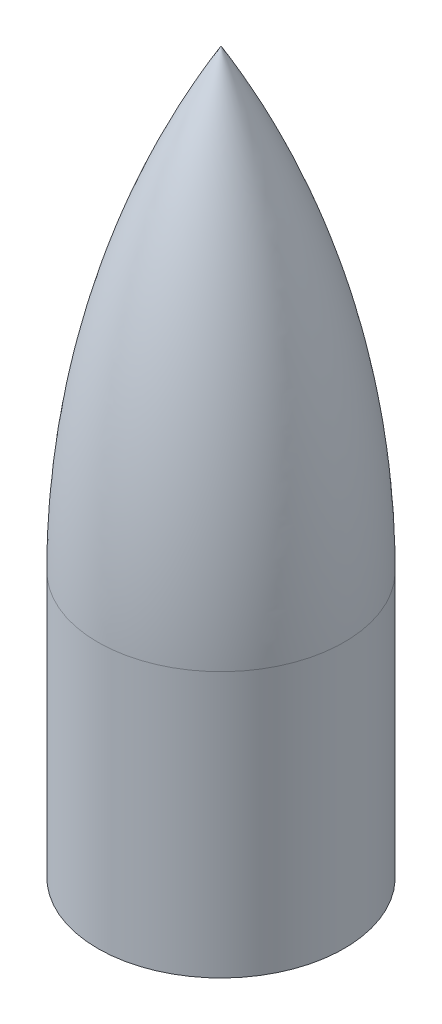
ISO-10303-21;
HEADER;
FILE_DESCRIPTION(('STEP AP214'),'2;1');
FILE_NAME('part.step','',(''),(''),'','','');
FILE_SCHEMA(('AUTOMOTIVE_DESIGN { 1 0 10303 214 1 1 1 1 }'));
ENDSEC;
DATA;
#1=APPLICATION_CONTEXT('core data for automotive mechanical design processes');
#2=APPLICATION_PROTOCOL_DEFINITION('international standard','automotive_design',2000,#1);
#3=PRODUCT_CONTEXT('',#1,'mechanical');
#4=PRODUCT('Part','Part','',(#3));
#5=PRODUCT_RELATED_PRODUCT_CATEGORY('part','',(#4));
#6=PRODUCT_DEFINITION_FORMATION('','',#4);
#7=PRODUCT_DEFINITION_CONTEXT('part definition',#1,'design');
#8=PRODUCT_DEFINITION('design','',#6,#7);
#9=PRODUCT_DEFINITION_SHAPE('','',#8);
#10=(LENGTH_UNIT() NAMED_UNIT(*) SI_UNIT(.MILLI.,.METRE.));
#11=(NAMED_UNIT(*) PLANE_ANGLE_UNIT() SI_UNIT($,.RADIAN.));
#12=(NAMED_UNIT(*) SI_UNIT($,.STERADIAN.) SOLID_ANGLE_UNIT());
#13=UNCERTAINTY_MEASURE_WITH_UNIT(LENGTH_MEASURE(1.E-05),#10,'distance_accuracy_value','');
#14=(GEOMETRIC_REPRESENTATION_CONTEXT(3) GLOBAL_UNCERTAINTY_ASSIGNED_CONTEXT((#13)) GLOBAL_UNIT_ASSIGNED_CONTEXT((#10,
#11,#12)) REPRESENTATION_CONTEXT('',''));
#15=CARTESIAN_POINT('',(0.,0.,0.));
#16=DIRECTION('',(0.,0.,1.));
#17=DIRECTION('',(1.,0.,0.));
#18=AXIS2_PLACEMENT_3D('',#15,#16,#17);
#19=CARTESIAN_POINT('',(0.,0.,0.));
#20=DIRECTION('',(0.,1.,0.));
#21=DIRECTION('',(0.,0.,1.));
#22=AXIS2_PLACEMENT_3D('',#19,#20,#21);
#23=PLANE('',#22);
#24=CARTESIAN_POINT('',(0.,0.,0.));
#25=DIRECTION('',(0.,-1.,0.));
#26=DIRECTION('',(0.,0.,-1.));
#27=AXIS2_PLACEMENT_3D('',#24,#25,#26);
#28=CIRCLE('',#27,3.25);
#29=CARTESIAN_POINT('',(0.,0.,-3.25));
#30=VERTEX_POINT('',#29);
#31=EDGE_CURVE('E11',#30,#30,#28,.T.);
#32=ORIENTED_EDGE('',*,*,#31,.T.);
#33=EDGE_LOOP('',(#32));
#34=FACE_BOUND('',#33,.T.);
#35=ADVANCED_FACE('F33',(#34),#23,.F.);
#36=CARTESIAN_POINT('',(0.,0.,0.));
#37=DIRECTION('',(0.,-1.,0.));
#38=DIRECTION('',(0.,0.,-1.));
#39=AXIS2_PLACEMENT_3D('',#36,#37,#38);
#40=CYLINDRICAL_SURFACE('',#39,3.25);
#41=ORIENTED_EDGE('',*,*,#31,.F.);
#42=EDGE_LOOP('',(#41));
#43=FACE_BOUND('',#42,.T.);
#44=CARTESIAN_POINT('',(0.,7.,0.));
#45=DIRECTION('',(0.,-1.,0.));
#46=DIRECTION('',(0.,0.,-1.));
#47=AXIS2_PLACEMENT_3D('',#44,#45,#46);
#48=CIRCLE('',#47,3.25);
#49=CARTESIAN_POINT('',(0.,7.,-3.25));
#50=VERTEX_POINT('',#49);
#51=EDGE_CURVE('E39',#50,#50,#48,.T.);
#52=ORIENTED_EDGE('',*,*,#51,.T.);
#53=EDGE_LOOP('',(#52));
#54=FACE_BOUND('',#53,.T.);
#55=ADVANCED_FACE('F44',(#43,#54),#40,.T.);
#56=CARTESIAN_POINT('',(0.,7.,20.5288461538462));
#57=DIRECTION('',(-1.,0.,0.));
#58=DIRECTION('',(0.,0.,-1.));
#59=AXIS2_PLACEMENT_3D('',#56,#57,#58);
#60=CIRCLE('',#59,23.7788461538462);
#61=TRIMMED_CURVE('',#60,(PARAMETER_VALUE(-0.528976765098465)),
(PARAMETER_VALUE(0.528976765098465)),.T.,.PARAMETER.);
#62=CARTESIAN_POINT('',(0.,7.,0.));
#63=DIRECTION('',(0.,-1.,0.));
#64=AXIS1_PLACEMENT('',#62,#63);
#65=SURFACE_OF_REVOLUTION('',#61,#64);
#66=ORIENTED_EDGE('',*,*,#51,.F.);
#67=EDGE_LOOP('',(#66));
#68=FACE_BOUND('',#67,.T.);
#69=CARTESIAN_POINT('',(0.,19.,0.));
#70=VERTEX_POINT('',#69);
#71=VERTEX_LOOP('',#70);
#72=FACE_BOUND('',#71,.T.);
#73=ADVANCED_FACE('F42',(#68,#72),#65,.T.);
#74=CLOSED_SHELL('',(#35,#55,#73));
#75=MANIFOLD_SOLID_BREP('B2',#74);
#76=ADVANCED_BREP_SHAPE_REPRESENTATION('',(#18,#75),#14);
#77=SHAPE_DEFINITION_REPRESENTATION(#9,#76);
ENDSEC;
END-ISO-10303-21;
